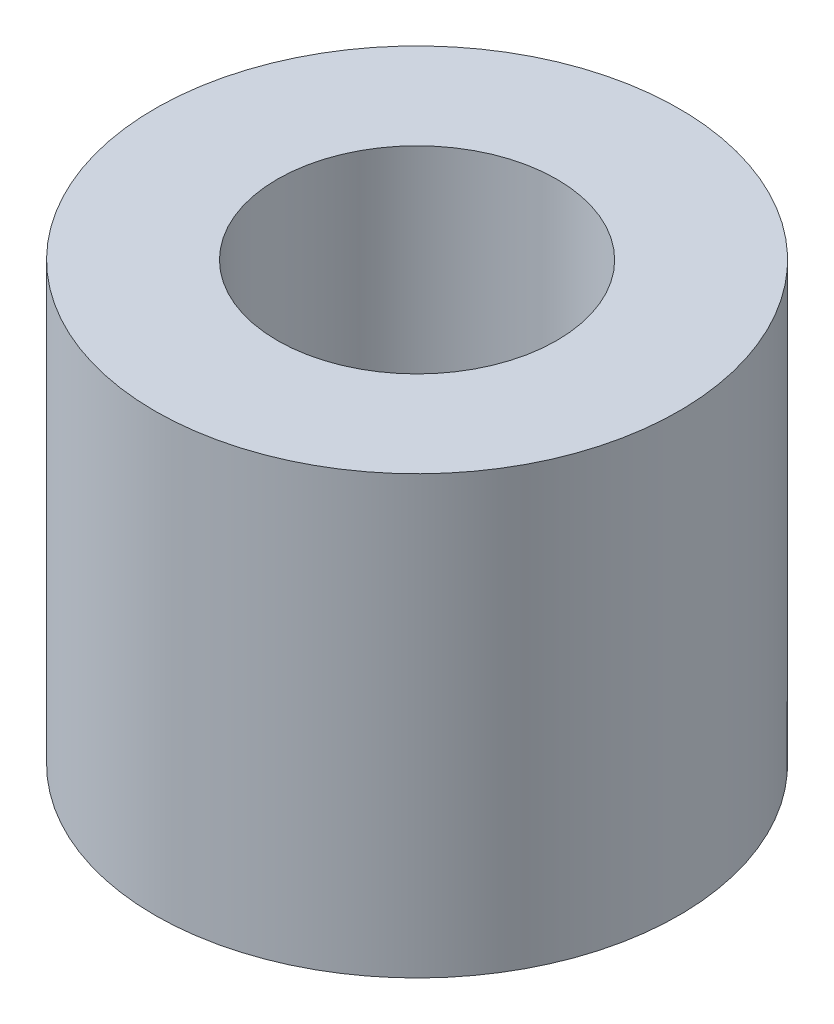
ISO-10303-21;
HEADER;
FILE_DESCRIPTION(('STEP AP214'),'2;1');
FILE_NAME('part.step','',(''),(''),'','','');
FILE_SCHEMA(('AUTOMOTIVE_DESIGN { 1 0 10303 214 1 1 1 1 }'));
ENDSEC;
DATA;
#1=APPLICATION_CONTEXT('core data for automotive mechanical design processes');
#2=APPLICATION_PROTOCOL_DEFINITION('international standard','automotive_design',2000,#1);
#3=PRODUCT_CONTEXT('',#1,'mechanical');
#4=PRODUCT('Part','Part','',(#3));
#5=PRODUCT_RELATED_PRODUCT_CATEGORY('part','',(#4));
#6=PRODUCT_DEFINITION_FORMATION('','',#4);
#7=PRODUCT_DEFINITION_CONTEXT('part definition',#1,'design');
#8=PRODUCT_DEFINITION('design','',#6,#7);
#9=PRODUCT_DEFINITION_SHAPE('','',#8);
#10=(LENGTH_UNIT() NAMED_UNIT(*) SI_UNIT(.MILLI.,.METRE.));
#11=(NAMED_UNIT(*) PLANE_ANGLE_UNIT() SI_UNIT($,.RADIAN.));
#12=(NAMED_UNIT(*) SI_UNIT($,.STERADIAN.) SOLID_ANGLE_UNIT());
#13=UNCERTAINTY_MEASURE_WITH_UNIT(LENGTH_MEASURE(1.E-05),#10,'distance_accuracy_value','');
#14=(GEOMETRIC_REPRESENTATION_CONTEXT(3) GLOBAL_UNCERTAINTY_ASSIGNED_CONTEXT((#13)) GLOBAL_UNIT_ASSIGNED_CONTEXT((#10,
#11,#12)) REPRESENTATION_CONTEXT('',''));
#15=CARTESIAN_POINT('',(0.,0.,0.));
#16=DIRECTION('',(0.,0.,1.));
#17=DIRECTION('',(1.,0.,0.));
#18=AXIS2_PLACEMENT_3D('',#15,#16,#17);
#19=CARTESIAN_POINT('',(0.,5.,0.));
#20=DIRECTION('',(0.,1.,0.));
#21=DIRECTION('',(0.,0.,1.));
#22=AXIS2_PLACEMENT_3D('',#19,#20,#21);
#23=PLANE('',#22);
#24=CARTESIAN_POINT('',(0.,5.,0.));
#25=DIRECTION('',(0.,1.,0.));
#26=DIRECTION('',(0.,0.,1.));
#27=AXIS2_PLACEMENT_3D('',#24,#25,#26);
#28=CIRCLE('',#27,3.);
#29=CARTESIAN_POINT('',(0.,5.,3.));
#30=VERTEX_POINT('',#29);
#31=EDGE_CURVE('E10',#30,#30,#28,.T.);
#32=ORIENTED_EDGE('',*,*,#31,.T.);
#33=EDGE_LOOP('',(#32));
#34=FACE_BOUND('',#33,.T.);
#35=CARTESIAN_POINT('',(0.,5.,0.));
#36=DIRECTION('',(0.,1.,0.));
#37=DIRECTION('',(0.,0.,1.));
#38=AXIS2_PLACEMENT_3D('',#35,#36,#37);
#39=CIRCLE('',#38,1.6);
#40=CARTESIAN_POINT('',(0.,5.,1.6));
#41=VERTEX_POINT('',#40);
#42=EDGE_CURVE('E41',#41,#41,#39,.T.);
#43=ORIENTED_EDGE('',*,*,#42,.F.);
#44=EDGE_LOOP('',(#43));
#45=FACE_BOUND('',#44,.T.);
#46=ADVANCED_FACE('F30',(#34,#45),#23,.T.);
#47=CARTESIAN_POINT('',(0.,0.,0.));
#48=DIRECTION('',(0.,1.,0.));
#49=DIRECTION('',(0.,0.,1.));
#50=AXIS2_PLACEMENT_3D('',#47,#48,#49);
#51=PLANE('',#50);
#52=CARTESIAN_POINT('',(0.,0.,0.));
#53=DIRECTION('',(0.,1.,0.));
#54=DIRECTION('',(0.,0.,1.));
#55=AXIS2_PLACEMENT_3D('',#52,#53,#54);
#56=CIRCLE('',#55,3.);
#57=CARTESIAN_POINT('',(0.,0.,3.));
#58=VERTEX_POINT('',#57);
#59=EDGE_CURVE('E34',#58,#58,#56,.T.);
#60=ORIENTED_EDGE('',*,*,#59,.F.);
#61=EDGE_LOOP('',(#60));
#62=FACE_BOUND('',#61,.T.);
#63=CARTESIAN_POINT('',(0.,0.,0.));
#64=DIRECTION('',(0.,1.,0.));
#65=DIRECTION('',(0.,0.,1.));
#66=AXIS2_PLACEMENT_3D('',#63,#64,#65);
#67=CIRCLE('',#66,1.6);
#68=CARTESIAN_POINT('',(0.,0.,1.6));
#69=VERTEX_POINT('',#68);
#70=EDGE_CURVE('E43',#69,#69,#67,.T.);
#71=ORIENTED_EDGE('',*,*,#70,.T.);
#72=EDGE_LOOP('',(#71));
#73=FACE_BOUND('',#72,.T.);
#74=ADVANCED_FACE('F53',(#62,#73),#51,.F.);
#75=CARTESIAN_POINT('',(0.,5.,0.));
#76=DIRECTION('',(0.,-1.,0.));
#77=DIRECTION('',(0.,0.,-1.));
#78=AXIS2_PLACEMENT_3D('',#75,#76,#77);
#79=CYLINDRICAL_SURFACE('',#78,3.);
#80=ORIENTED_EDGE('',*,*,#31,.F.);
#81=EDGE_LOOP('',(#80));
#82=FACE_BOUND('',#81,.T.);
#83=ORIENTED_EDGE('',*,*,#59,.T.);
#84=EDGE_LOOP('',(#83));
#85=FACE_BOUND('',#84,.T.);
#86=ADVANCED_FACE('F32',(#82,#85),#79,.T.);
#87=CARTESIAN_POINT('',(0.,5.,0.));
#88=DIRECTION('',(0.,-1.,0.));
#89=DIRECTION('',(0.,0.,-1.));
#90=AXIS2_PLACEMENT_3D('',#87,#88,#89);
#91=CYLINDRICAL_SURFACE('',#90,1.6);
#92=ORIENTED_EDGE('',*,*,#42,.T.);
#93=EDGE_LOOP('',(#92));
#94=FACE_BOUND('',#93,.T.);
#95=ORIENTED_EDGE('',*,*,#70,.F.);
#96=EDGE_LOOP('',(#95));
#97=FACE_BOUND('',#96,.T.);
#98=ADVANCED_FACE('F49',(#94,#97),#91,.F.);
#99=CLOSED_SHELL('',(#46,#74,#86,#98));
#100=MANIFOLD_SOLID_BREP('B2',#99);
#101=ADVANCED_BREP_SHAPE_REPRESENTATION('',(#18,#100),#14);
#102=SHAPE_DEFINITION_REPRESENTATION(#9,#101);
ENDSEC;
END-ISO-10303-21;
